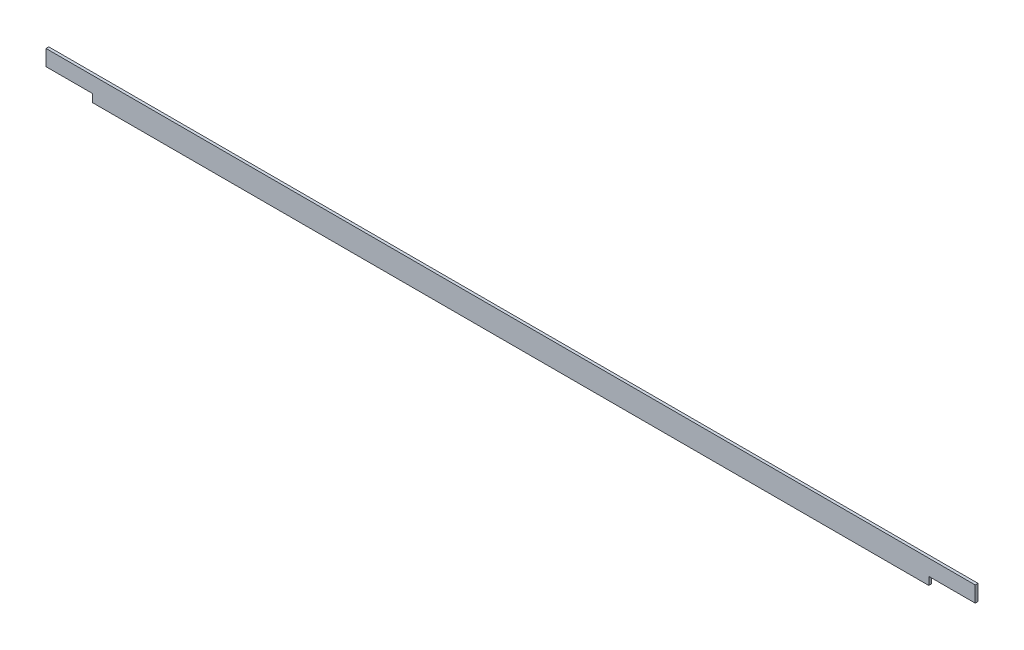
ISO-10303-21;
HEADER;
FILE_DESCRIPTION(('STEP AP214'),'2;1');
FILE_NAME('part.step','',(''),(''),'','','');
FILE_SCHEMA(('AUTOMOTIVE_DESIGN { 1 0 10303 214 1 1 1 1 }'));
ENDSEC;
DATA;
#1=APPLICATION_CONTEXT('core data for automotive mechanical design processes');
#2=APPLICATION_PROTOCOL_DEFINITION('international standard','automotive_design',2000,#1);
#3=PRODUCT_CONTEXT('',#1,'mechanical');
#4=PRODUCT('Part','Part','',(#3));
#5=PRODUCT_RELATED_PRODUCT_CATEGORY('part','',(#4));
#6=PRODUCT_DEFINITION_FORMATION('','',#4);
#7=PRODUCT_DEFINITION_CONTEXT('part definition',#1,'design');
#8=PRODUCT_DEFINITION('design','',#6,#7);
#9=PRODUCT_DEFINITION_SHAPE('','',#8);
#10=(LENGTH_UNIT() NAMED_UNIT(*) SI_UNIT(.MILLI.,.METRE.));
#11=(NAMED_UNIT(*) PLANE_ANGLE_UNIT() SI_UNIT($,.RADIAN.));
#12=(NAMED_UNIT(*) SI_UNIT($,.STERADIAN.) SOLID_ANGLE_UNIT());
#13=UNCERTAINTY_MEASURE_WITH_UNIT(LENGTH_MEASURE(1.E-05),#10,'distance_accuracy_value','');
#14=(GEOMETRIC_REPRESENTATION_CONTEXT(3) GLOBAL_UNCERTAINTY_ASSIGNED_CONTEXT((#13)) GLOBAL_UNIT_ASSIGNED_CONTEXT((#10,
#11,#12)) REPRESENTATION_CONTEXT('',''));
#15=CARTESIAN_POINT('',(0.,0.,0.));
#16=DIRECTION('',(0.,0.,1.));
#17=DIRECTION('',(1.,0.,0.));
#18=AXIS2_PLACEMENT_3D('',#15,#16,#17);
#19=CARTESIAN_POINT('',(450.,0.,1.5));
#20=DIRECTION('',(1.,0.,0.));
#21=DIRECTION('',(0.,0.,-1.));
#22=AXIS2_PLACEMENT_3D('',#19,#20,#21);
#23=PLANE('',#22);
#24=DIRECTION('',(0.,-1.,0.));
#25=VECTOR('',#24,1.);
#26=CARTESIAN_POINT('',(450.,0.,-1.5));
#27=LINE('',#26,#25);
#28=CARTESIAN_POINT('',(450.,-8.5,-1.5));
#29=VERTEX_POINT('',#28);
#30=CARTESIAN_POINT('',(450.,-17.,-1.5));
#31=VERTEX_POINT('',#30);
#32=EDGE_CURVE('E131',#29,#31,#27,.T.);
#33=ORIENTED_EDGE('',*,*,#32,.F.);
#34=DIRECTION('',(0.,0.,-1.));
#35=VECTOR('',#34,1.);
#36=CARTESIAN_POINT('',(450.,-8.5,1.5));
#37=LINE('',#36,#35);
#38=CARTESIAN_POINT('',(450.,-8.5,1.5));
#39=VERTEX_POINT('',#38);
#40=EDGE_CURVE('E11',#39,#29,#37,.T.);
#41=ORIENTED_EDGE('',*,*,#40,.F.);
#42=DIRECTION('',(0.,-1.,0.));
#43=VECTOR('',#42,1.);
#44=CARTESIAN_POINT('',(450.,0.,1.5));
#45=LINE('',#44,#43);
#46=CARTESIAN_POINT('',(450.,-17.,1.5));
#47=VERTEX_POINT('',#46);
#48=EDGE_CURVE('E148',#39,#47,#45,.T.);
#49=ORIENTED_EDGE('',*,*,#48,.T.);
#50=DIRECTION('',(0.,0.,-1.));
#51=VECTOR('',#50,1.);
#52=CARTESIAN_POINT('',(450.,-17.,1.5));
#53=LINE('',#52,#51);
#54=EDGE_CURVE('E87',#47,#31,#53,.T.);
#55=ORIENTED_EDGE('',*,*,#54,.T.);
#56=EDGE_LOOP('',(#33,#41,#49,#55));
#57=FACE_BOUND('',#56,.T.);
#58=ADVANCED_FACE('F36',(#57),#23,.T.);
#59=CARTESIAN_POINT('',(0.,-8.5,1.5));
#60=DIRECTION('',(0.,1.,0.));
#61=DIRECTION('',(0.,0.,1.));
#62=AXIS2_PLACEMENT_3D('',#59,#60,#61);
#63=PLANE('',#62);
#64=DIRECTION('',(1.,0.,0.));
#65=VECTOR('',#64,1.);
#66=CARTESIAN_POINT('',(0.,-8.5,-1.5));
#67=LINE('',#66,#65);
#68=CARTESIAN_POINT('',(500.,-8.5,-1.5));
#69=VERTEX_POINT('',#68);
#70=EDGE_CURVE('E134',#29,#69,#67,.T.);
#71=ORIENTED_EDGE('',*,*,#70,.T.);
#72=DIRECTION('',(0.,0.,-1.));
#73=VECTOR('',#72,1.);
#74=CARTESIAN_POINT('',(500.,-8.5,1.5));
#75=LINE('',#74,#73);
#76=CARTESIAN_POINT('',(500.,-8.5,1.5));
#77=VERTEX_POINT('',#76);
#78=EDGE_CURVE('E44',#77,#69,#75,.T.);
#79=ORIENTED_EDGE('',*,*,#78,.F.);
#80=DIRECTION('',(1.,0.,0.));
#81=VECTOR('',#80,1.);
#82=CARTESIAN_POINT('',(0.,-8.5,1.5));
#83=LINE('',#82,#81);
#84=EDGE_CURVE('E117',#39,#77,#83,.T.);
#85=ORIENTED_EDGE('',*,*,#84,.F.);
#86=ORIENTED_EDGE('',*,*,#40,.T.);
#87=EDGE_LOOP('',(#71,#79,#85,#86));
#88=FACE_BOUND('',#87,.T.);
#89=ADVANCED_FACE('F175',(#88),#63,.F.);
#90=CARTESIAN_POINT('',(500.,0.,1.5));
#91=DIRECTION('',(-1.,0.,0.));
#92=DIRECTION('',(0.,0.,1.));
#93=AXIS2_PLACEMENT_3D('',#90,#91,#92);
#94=PLANE('',#93);
#95=DIRECTION('',(0.,1.,0.));
#96=VECTOR('',#95,1.);
#97=CARTESIAN_POINT('',(500.,0.,-1.5));
#98=LINE('',#97,#96);
#99=CARTESIAN_POINT('',(500.,8.5,-1.5));
#100=VERTEX_POINT('',#99);
#101=EDGE_CURVE('E136',#69,#100,#98,.T.);
#102=ORIENTED_EDGE('',*,*,#101,.T.);
#103=DIRECTION('',(0.,0.,-1.));
#104=VECTOR('',#103,1.);
#105=CARTESIAN_POINT('',(500.,8.5,1.5));
#106=LINE('',#105,#104);
#107=CARTESIAN_POINT('',(500.,8.5,1.5));
#108=VERTEX_POINT('',#107);
#109=EDGE_CURVE('E154',#108,#100,#106,.T.);
#110=ORIENTED_EDGE('',*,*,#109,.F.);
#111=DIRECTION('',(0.,1.,0.));
#112=VECTOR('',#111,1.);
#113=CARTESIAN_POINT('',(500.,0.,1.5));
#114=LINE('',#113,#112);
#115=EDGE_CURVE('E162',#77,#108,#114,.T.);
#116=ORIENTED_EDGE('',*,*,#115,.F.);
#117=ORIENTED_EDGE('',*,*,#78,.T.);
#118=EDGE_LOOP('',(#102,#110,#116,#117));
#119=FACE_BOUND('',#118,.T.);
#120=ADVANCED_FACE('F160',(#119),#94,.F.);
#121=CARTESIAN_POINT('',(0.,8.5,1.5));
#122=DIRECTION('',(0.,1.,0.));
#123=DIRECTION('',(0.,0.,1.));
#124=AXIS2_PLACEMENT_3D('',#121,#122,#123);
#125=PLANE('',#124);
#126=DIRECTION('',(1.,0.,0.));
#127=VECTOR('',#126,1.);
#128=CARTESIAN_POINT('',(0.,8.5,-1.5));
#129=LINE('',#128,#127);
#130=CARTESIAN_POINT('',(-500.,8.5,-1.5));
#131=VERTEX_POINT('',#130);
#132=EDGE_CURVE('E139',#131,#100,#129,.T.);
#133=ORIENTED_EDGE('',*,*,#132,.F.);
#134=DIRECTION('',(0.,0.,-1.));
#135=VECTOR('',#134,1.);
#136=CARTESIAN_POINT('',(-500.,8.5,1.5));
#137=LINE('',#136,#135);
#138=CARTESIAN_POINT('',(-500.,8.5,1.5));
#139=VERTEX_POINT('',#138);
#140=EDGE_CURVE('E152',#139,#131,#137,.T.);
#141=ORIENTED_EDGE('',*,*,#140,.F.);
#142=DIRECTION('',(1.,0.,0.));
#143=VECTOR('',#142,1.);
#144=CARTESIAN_POINT('',(0.,8.5,1.5));
#145=LINE('',#144,#143);
#146=EDGE_CURVE('E172',#139,#108,#145,.T.);
#147=ORIENTED_EDGE('',*,*,#146,.T.);
#148=ORIENTED_EDGE('',*,*,#109,.T.);
#149=EDGE_LOOP('',(#133,#141,#147,#148));
#150=FACE_BOUND('',#149,.T.);
#151=ADVANCED_FACE('F170',(#150),#125,.T.);
#152=CARTESIAN_POINT('',(-500.,0.,1.5));
#153=DIRECTION('',(-1.,0.,0.));
#154=DIRECTION('',(0.,0.,1.));
#155=AXIS2_PLACEMENT_3D('',#152,#153,#154);
#156=PLANE('',#155);
#157=DIRECTION('',(0.,1.,0.));
#158=VECTOR('',#157,1.);
#159=CARTESIAN_POINT('',(-500.,0.,-1.5));
#160=LINE('',#159,#158);
#161=CARTESIAN_POINT('',(-500.,-8.5,-1.5));
#162=VERTEX_POINT('',#161);
#163=EDGE_CURVE('E142',#162,#131,#160,.T.);
#164=ORIENTED_EDGE('',*,*,#163,.F.);
#165=DIRECTION('',(0.,0.,-1.));
#166=VECTOR('',#165,1.);
#167=CARTESIAN_POINT('',(-500.,-8.5,1.5));
#168=LINE('',#167,#166);
#169=CARTESIAN_POINT('',(-500.,-8.5,1.5));
#170=VERTEX_POINT('',#169);
#171=EDGE_CURVE('E122',#170,#162,#168,.T.);
#172=ORIENTED_EDGE('',*,*,#171,.F.);
#173=DIRECTION('',(0.,1.,0.));
#174=VECTOR('',#173,1.);
#175=CARTESIAN_POINT('',(-500.,0.,1.5));
#176=LINE('',#175,#174);
#177=EDGE_CURVE('E114',#170,#139,#176,.T.);
#178=ORIENTED_EDGE('',*,*,#177,.T.);
#179=ORIENTED_EDGE('',*,*,#140,.T.);
#180=EDGE_LOOP('',(#164,#172,#178,#179));
#181=FACE_BOUND('',#180,.T.);
#182=ADVANCED_FACE('F185',(#181),#156,.T.);
#183=CARTESIAN_POINT('',(-450.,-8.5,-1.5));
#184=VERTEX_POINT('',#183);
#185=EDGE_CURVE('E121',#162,#184,#67,.T.);
#186=ORIENTED_EDGE('',*,*,#185,.T.);
#187=DIRECTION('',(0.,0.,-1.));
#188=VECTOR('',#187,1.);
#189=CARTESIAN_POINT('',(-450.,-8.5,1.5));
#190=LINE('',#189,#188);
#191=CARTESIAN_POINT('',(-450.,-8.5,1.5));
#192=VERTEX_POINT('',#191);
#193=EDGE_CURVE('E118',#192,#184,#190,.T.);
#194=ORIENTED_EDGE('',*,*,#193,.F.);
#195=EDGE_CURVE('E107',#170,#192,#83,.T.);
#196=ORIENTED_EDGE('',*,*,#195,.F.);
#197=ORIENTED_EDGE('',*,*,#171,.T.);
#198=EDGE_LOOP('',(#186,#194,#196,#197));
#199=FACE_BOUND('',#198,.T.);
#200=ADVANCED_FACE('F119',(#199),#63,.F.);
#201=CARTESIAN_POINT('',(-450.,0.,1.5));
#202=DIRECTION('',(1.,0.,0.));
#203=DIRECTION('',(0.,0.,-1.));
#204=AXIS2_PLACEMENT_3D('',#201,#202,#203);
#205=PLANE('',#204);
#206=DIRECTION('',(0.,-1.,0.));
#207=VECTOR('',#206,1.);
#208=CARTESIAN_POINT('',(-450.,0.,-1.5));
#209=LINE('',#208,#207);
#210=CARTESIAN_POINT('',(-450.,-17.,-1.5));
#211=VERTEX_POINT('',#210);
#212=EDGE_CURVE('E80',#184,#211,#209,.T.);
#213=ORIENTED_EDGE('',*,*,#212,.T.);
#214=DIRECTION('',(0.,0.,-1.));
#215=VECTOR('',#214,1.);
#216=CARTESIAN_POINT('',(-450.,-17.,1.5));
#217=LINE('',#216,#215);
#218=CARTESIAN_POINT('',(-450.,-17.,1.5));
#219=VERTEX_POINT('',#218);
#220=EDGE_CURVE('E123',#219,#211,#217,.T.);
#221=ORIENTED_EDGE('',*,*,#220,.F.);
#222=DIRECTION('',(0.,-1.,0.));
#223=VECTOR('',#222,1.);
#224=CARTESIAN_POINT('',(-450.,0.,1.5));
#225=LINE('',#224,#223);
#226=EDGE_CURVE('E111',#192,#219,#225,.T.);
#227=ORIENTED_EDGE('',*,*,#226,.F.);
#228=ORIENTED_EDGE('',*,*,#193,.T.);
#229=EDGE_LOOP('',(#213,#221,#227,#228));
#230=FACE_BOUND('',#229,.T.);
#231=ADVANCED_FACE('F125',(#230),#205,.F.);
#232=CARTESIAN_POINT('',(0.,-17.,1.5));
#233=DIRECTION('',(0.,1.,0.));
#234=DIRECTION('',(0.,0.,1.));
#235=AXIS2_PLACEMENT_3D('',#232,#233,#234);
#236=PLANE('',#235);
#237=DIRECTION('',(1.,0.,0.));
#238=VECTOR('',#237,1.);
#239=CARTESIAN_POINT('',(0.,-17.,-1.5));
#240=LINE('',#239,#238);
#241=EDGE_CURVE('E146',#211,#31,#240,.T.);
#242=ORIENTED_EDGE('',*,*,#241,.T.);
#243=ORIENTED_EDGE('',*,*,#54,.F.);
#244=DIRECTION('',(1.,0.,0.));
#245=VECTOR('',#244,1.);
#246=CARTESIAN_POINT('',(0.,-17.,1.5));
#247=LINE('',#246,#245);
#248=EDGE_CURVE('E52',#219,#47,#247,.T.);
#249=ORIENTED_EDGE('',*,*,#248,.F.);
#250=ORIENTED_EDGE('',*,*,#220,.T.);
#251=EDGE_LOOP('',(#242,#243,#249,#250));
#252=FACE_BOUND('',#251,.T.);
#253=ADVANCED_FACE('F190',(#252),#236,.F.);
#254=CARTESIAN_POINT('',(0.,0.,1.5));
#255=DIRECTION('',(0.,0.,1.));
#256=DIRECTION('',(1.,0.,0.));
#257=AXIS2_PLACEMENT_3D('',#254,#255,#256);
#258=PLANE('',#257);
#259=ORIENTED_EDGE('',*,*,#48,.F.);
#260=ORIENTED_EDGE('',*,*,#84,.T.);
#261=ORIENTED_EDGE('',*,*,#115,.T.);
#262=ORIENTED_EDGE('',*,*,#146,.F.);
#263=ORIENTED_EDGE('',*,*,#177,.F.);
#264=ORIENTED_EDGE('',*,*,#195,.T.);
#265=ORIENTED_EDGE('',*,*,#226,.T.);
#266=ORIENTED_EDGE('',*,*,#248,.T.);
#267=EDGE_LOOP('',(#259,#260,#261,#262,#263,#264,#265,#266));
#268=FACE_BOUND('',#267,.T.);
#269=ADVANCED_FACE('F109',(#268),#258,.T.);
#270=CARTESIAN_POINT('',(0.,0.,-1.5));
#271=DIRECTION('',(0.,0.,1.));
#272=DIRECTION('',(1.,0.,0.));
#273=AXIS2_PLACEMENT_3D('',#270,#271,#272);
#274=PLANE('',#273);
#275=ORIENTED_EDGE('',*,*,#32,.T.);
#276=ORIENTED_EDGE('',*,*,#241,.F.);
#277=ORIENTED_EDGE('',*,*,#212,.F.);
#278=ORIENTED_EDGE('',*,*,#185,.F.);
#279=ORIENTED_EDGE('',*,*,#163,.T.);
#280=ORIENTED_EDGE('',*,*,#132,.T.);
#281=ORIENTED_EDGE('',*,*,#101,.F.);
#282=ORIENTED_EDGE('',*,*,#70,.F.);
#283=EDGE_LOOP('',(#275,#276,#277,#278,#279,#280,#281,#282));
#284=FACE_BOUND('',#283,.T.);
#285=ADVANCED_FACE('F166',(#284),#274,.F.);
#286=CLOSED_SHELL('',(#58,#89,#120,#151,#182,#200,#231,#253,#269,#285));
#287=MANIFOLD_SOLID_BREP('B2',#286);
#288=ADVANCED_BREP_SHAPE_REPRESENTATION('',(#18,#287),#14);
#289=SHAPE_DEFINITION_REPRESENTATION(#9,#288);
ENDSEC;
END-ISO-10303-21;
